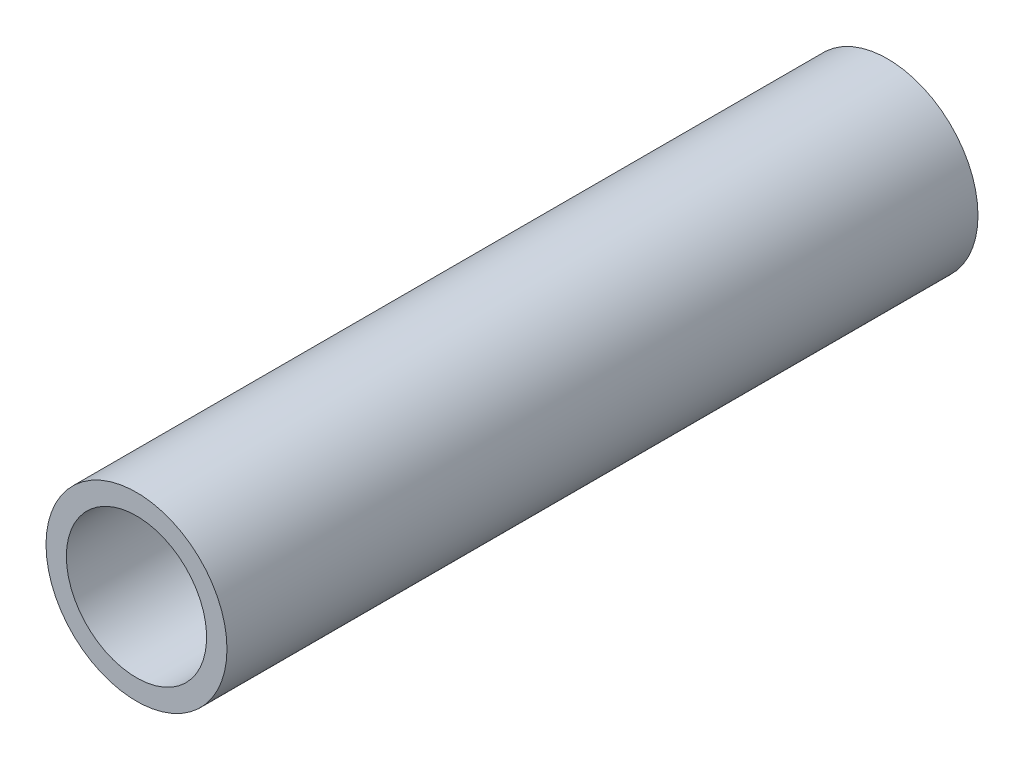
ISO-10303-21;
HEADER;
FILE_DESCRIPTION(('STEP AP214'),'2;1');
FILE_NAME('part.step','',(''),(''),'','','');
FILE_SCHEMA(('AUTOMOTIVE_DESIGN { 1 0 10303 214 1 1 1 1 }'));
ENDSEC;
DATA;
#1=APPLICATION_CONTEXT('core data for automotive mechanical design processes');
#2=APPLICATION_PROTOCOL_DEFINITION('international standard','automotive_design',2000,#1);
#3=PRODUCT_CONTEXT('',#1,'mechanical');
#4=PRODUCT('Part','Part','',(#3));
#5=PRODUCT_RELATED_PRODUCT_CATEGORY('part','',(#4));
#6=PRODUCT_DEFINITION_FORMATION('','',#4);
#7=PRODUCT_DEFINITION_CONTEXT('part definition',#1,'design');
#8=PRODUCT_DEFINITION('design','',#6,#7);
#9=PRODUCT_DEFINITION_SHAPE('','',#8);
#10=(LENGTH_UNIT() NAMED_UNIT(*) SI_UNIT(.MILLI.,.METRE.));
#11=(NAMED_UNIT(*) PLANE_ANGLE_UNIT() SI_UNIT($,.RADIAN.));
#12=(NAMED_UNIT(*) SI_UNIT($,.STERADIAN.) SOLID_ANGLE_UNIT());
#13=UNCERTAINTY_MEASURE_WITH_UNIT(LENGTH_MEASURE(1.E-05),#10,'distance_accuracy_value','');
#14=(GEOMETRIC_REPRESENTATION_CONTEXT(3) GLOBAL_UNCERTAINTY_ASSIGNED_CONTEXT((#13)) GLOBAL_UNIT_ASSIGNED_CONTEXT((#10,
#11,#12)) REPRESENTATION_CONTEXT('',''));
#15=CARTESIAN_POINT('',(0.,0.,0.));
#16=DIRECTION('',(0.,0.,1.));
#17=DIRECTION('',(1.,0.,0.));
#18=AXIS2_PLACEMENT_3D('',#15,#16,#17);
#19=CARTESIAN_POINT('',(0.,0.,8.3));
#20=DIRECTION('',(0.,0.,1.));
#21=DIRECTION('',(1.,0.,0.));
#22=AXIS2_PLACEMENT_3D('',#19,#20,#21);
#23=PLANE('',#22);
#24=CARTESIAN_POINT('',(0.,0.,8.3));
#25=DIRECTION('',(0.,0.,1.));
#26=DIRECTION('',(1.,0.,0.));
#27=AXIS2_PLACEMENT_3D('',#24,#25,#26);
#28=CIRCLE('',#27,1.);
#29=CARTESIAN_POINT('',(-1.,0.,8.3));
#30=VERTEX_POINT('',#29);
#31=EDGE_CURVE('E10',#30,#30,#28,.T.);
#32=ORIENTED_EDGE('',*,*,#31,.T.);
#33=EDGE_LOOP('',(#32));
#34=FACE_BOUND('',#33,.T.);
#35=CARTESIAN_POINT('',(0.,0.,8.3));
#36=DIRECTION('',(0.,0.,1.));
#37=DIRECTION('',(1.,0.,0.));
#38=AXIS2_PLACEMENT_3D('',#35,#36,#37);
#39=CIRCLE('',#38,0.775);
#40=CARTESIAN_POINT('',(-0.775,0.,8.3));
#41=VERTEX_POINT('',#40);
#42=EDGE_CURVE('E46',#41,#41,#39,.T.);
#43=ORIENTED_EDGE('',*,*,#42,.F.);
#44=EDGE_LOOP('',(#43));
#45=FACE_BOUND('',#44,.T.);
#46=ADVANCED_FACE('F35',(#34,#45),#23,.T.);
#47=CARTESIAN_POINT('',(0.,0.,0.));
#48=DIRECTION('',(0.,0.,1.));
#49=DIRECTION('',(1.,0.,0.));
#50=AXIS2_PLACEMENT_3D('',#47,#48,#49);
#51=PLANE('',#50);
#52=CARTESIAN_POINT('',(0.,0.,0.));
#53=DIRECTION('',(0.,0.,1.));
#54=DIRECTION('',(1.,0.,0.));
#55=AXIS2_PLACEMENT_3D('',#52,#53,#54);
#56=CIRCLE('',#55,1.);
#57=CARTESIAN_POINT('',(-1.,0.,0.));
#58=VERTEX_POINT('',#57);
#59=EDGE_CURVE('E39',#58,#58,#56,.T.);
#60=ORIENTED_EDGE('',*,*,#59,.F.);
#61=EDGE_LOOP('',(#60));
#62=FACE_BOUND('',#61,.T.);
#63=CARTESIAN_POINT('',(0.,0.,0.));
#64=DIRECTION('',(0.,0.,1.));
#65=DIRECTION('',(1.,0.,0.));
#66=AXIS2_PLACEMENT_3D('',#63,#64,#65);
#67=CIRCLE('',#66,0.775);
#68=CARTESIAN_POINT('',(-0.775,0.,0.));
#69=VERTEX_POINT('',#68);
#70=EDGE_CURVE('E48',#69,#69,#67,.T.);
#71=ORIENTED_EDGE('',*,*,#70,.T.);
#72=EDGE_LOOP('',(#71));
#73=FACE_BOUND('',#72,.T.);
#74=ADVANCED_FACE('F58',(#62,#73),#51,.F.);
#75=CARTESIAN_POINT('',(0.,0.,8.3));
#76=DIRECTION('',(0.,0.,-1.));
#77=DIRECTION('',(-1.,0.,0.));
#78=AXIS2_PLACEMENT_3D('',#75,#76,#77);
#79=CYLINDRICAL_SURFACE('',#78,1.);
#80=CARTESIAN_POINT('',(-1.,0.,8.3));
#81=CARTESIAN_POINT('',(-1.,0.,8.21354166666667));
#82=CARTESIAN_POINT('',(-1.,0.,8.12708333333333));
#83=CARTESIAN_POINT('',(-1.,0.,7.95416666666667));
#84=CARTESIAN_POINT('',(-1.,0.,7.86770833333333));
#85=CARTESIAN_POINT('',(-1.,0.,7.69479166666667));
#86=CARTESIAN_POINT('',(-1.,0.,7.60833333333333));
#87=CARTESIAN_POINT('',(-1.,0.,7.43541666666667));
#88=CARTESIAN_POINT('',(-1.,0.,7.34895833333333));
#89=CARTESIAN_POINT('',(-1.,0.,7.17604166666667));
#90=CARTESIAN_POINT('',(-1.,0.,7.08958333333333));
#91=CARTESIAN_POINT('',(-1.,0.,6.91666666666667));
#92=CARTESIAN_POINT('',(-1.,0.,6.83020833333333));
#93=CARTESIAN_POINT('',(-1.,0.,6.65729166666667));
#94=CARTESIAN_POINT('',(-1.,0.,6.57083333333333));
#95=CARTESIAN_POINT('',(-1.,0.,6.39791666666667));
#96=CARTESIAN_POINT('',(-1.,0.,6.31145833333333));
#97=CARTESIAN_POINT('',(-1.,0.,6.13854166666667));
#98=CARTESIAN_POINT('',(-1.,0.,6.05208333333333));
#99=CARTESIAN_POINT('',(-1.,0.,5.87916666666667));
#100=CARTESIAN_POINT('',(-1.,0.,5.79270833333333));
#101=CARTESIAN_POINT('',(-1.,0.,5.61979166666667));
#102=CARTESIAN_POINT('',(-1.,0.,5.53333333333333));
#103=CARTESIAN_POINT('',(-1.,0.,5.36041666666666));
#104=CARTESIAN_POINT('',(-1.,0.,5.27395833333333));
#105=CARTESIAN_POINT('',(-1.,0.,5.10104166666667));
#106=CARTESIAN_POINT('',(-1.,0.,5.01458333333333));
#107=CARTESIAN_POINT('',(-1.,0.,4.84166666666667));
#108=CARTESIAN_POINT('',(-1.,0.,4.75520833333333));
#109=CARTESIAN_POINT('',(-1.,0.,4.58229166666667));
#110=CARTESIAN_POINT('',(-1.,0.,4.49583333333333));
#111=CARTESIAN_POINT('',(-1.,0.,4.32291666666667));
#112=CARTESIAN_POINT('',(-1.,0.,4.23645833333333));
#113=CARTESIAN_POINT('',(-1.,0.,4.06354166666667));
#114=CARTESIAN_POINT('',(-1.,0.,3.97708333333333));
#115=CARTESIAN_POINT('',(-1.,0.,3.80416666666667));
#116=CARTESIAN_POINT('',(-1.,0.,3.71770833333333));
#117=CARTESIAN_POINT('',(-1.,0.,3.54479166666667));
#118=CARTESIAN_POINT('',(-1.,0.,3.45833333333333));
#119=CARTESIAN_POINT('',(-1.,0.,3.28541666666667));
#120=CARTESIAN_POINT('',(-1.,0.,3.19895833333333));
#121=CARTESIAN_POINT('',(-1.,0.,3.02604166666667));
#122=CARTESIAN_POINT('',(-1.,0.,2.93958333333333));
#123=CARTESIAN_POINT('',(-1.,0.,2.76666666666667));
#124=CARTESIAN_POINT('',(-1.,0.,2.68020833333333));
#125=CARTESIAN_POINT('',(-1.,0.,2.50729166666667));
#126=CARTESIAN_POINT('',(-1.,0.,2.42083333333333));
#127=CARTESIAN_POINT('',(-1.,0.,2.24791666666667));
#128=CARTESIAN_POINT('',(-1.,0.,2.16145833333333));
#129=CARTESIAN_POINT('',(-1.,0.,1.98854166666667));
#130=CARTESIAN_POINT('',(-1.,0.,1.90208333333333));
#131=CARTESIAN_POINT('',(-1.,0.,1.72916666666667));
#132=CARTESIAN_POINT('',(-1.,0.,1.64270833333333));
#133=CARTESIAN_POINT('',(-1.,0.,1.46979166666667));
#134=CARTESIAN_POINT('',(-1.,0.,1.38333333333333));
#135=CARTESIAN_POINT('',(-1.,0.,1.21041666666667));
#136=CARTESIAN_POINT('',(-1.,0.,1.12395833333333));
#137=CARTESIAN_POINT('',(-1.,0.,0.951041666666665));
#138=CARTESIAN_POINT('',(-1.,0.,0.864583333333332));
#139=CARTESIAN_POINT('',(-1.,0.,0.691666666666665));
#140=CARTESIAN_POINT('',(-1.,0.,0.605208333333332));
#141=CARTESIAN_POINT('',(-1.,0.,0.432291666666665));
#142=CARTESIAN_POINT('',(-1.,0.,0.345833333333332));
#143=CARTESIAN_POINT('',(-1.,0.,0.172916666666666));
#144=CARTESIAN_POINT('',(-1.,0.,0.086458333333333));
#145=CARTESIAN_POINT('',(-1.,0.,0.));
#146=B_SPLINE_CURVE_WITH_KNOTS('',3,(#80,#81,#82,#83,#84,#85,#86,#87,#88,#89,#90,#91,#92,#93,
#94,#95,#96,#97,#98,#99,#100,#101,#102,#103,#104,#105,#106,#107,#108,#109,#110,#111,#112,#113,
#114,#115,#116,#117,#118,#119,#120,#121,#122,#123,#124,#125,#126,#127,#128,#129,#130,#131,#132,
#133,#134,#135,#136,#137,#138,#139,#140,#141,#142,#143,#144,#145),.UNSPECIFIED.,.F.,.F.,(4,2,2,
2,2,2,2,2,2,2,2,2,2,2,2,2,2,2,2,2,2,2,2,2,2,2,2,2,2,2,2,2,4),(0.,0.259375000000001,
0.518750000000001,0.778125000000001,1.0375,1.296875,1.55625,1.815625,2.075,2.334375,2.59375,
2.853125,3.1125,3.371875,3.63125,3.890625,4.15,4.409375,4.66875,4.928125,5.1875,5.446875,
5.70625,5.965625,6.225,6.484375,6.74375,7.003125,7.2625,7.521875,7.78125,8.040625,8.3),.UNSPECIFIED.);
#147=EDGE_CURVE('BSEAM37',#30,#58,#146,.T.);
#148=ORIENTED_EDGE('',*,*,#31,.F.);
#149=ORIENTED_EDGE('',*,*,#59,.T.);
#150=ORIENTED_EDGE('',*,*,#147,.T.);
#151=ORIENTED_EDGE('',*,*,#147,.F.);
#152=EDGE_LOOP('',(#148,#150,#149,#151));
#153=FACE_BOUND('',#152,.T.);
#154=ADVANCED_FACE('F37',(#153),#79,.T.);
#155=CARTESIAN_POINT('',(0.,0.,8.3));
#156=DIRECTION('',(0.,0.,-1.));
#157=DIRECTION('',(-1.,0.,0.));
#158=AXIS2_PLACEMENT_3D('',#155,#156,#157);
#159=CYLINDRICAL_SURFACE('',#158,0.775);
#160=CARTESIAN_POINT('',(-0.775,0.,8.3));
#161=CARTESIAN_POINT('',(-0.775,0.,8.21354166666667));
#162=CARTESIAN_POINT('',(-0.775,0.,8.12708333333333));
#163=CARTESIAN_POINT('',(-0.775,0.,7.95416666666667));
#164=CARTESIAN_POINT('',(-0.775,0.,7.86770833333333));
#165=CARTESIAN_POINT('',(-0.775,0.,7.69479166666667));
#166=CARTESIAN_POINT('',(-0.775,0.,7.60833333333333));
#167=CARTESIAN_POINT('',(-0.775,0.,7.43541666666667));
#168=CARTESIAN_POINT('',(-0.775,0.,7.34895833333333));
#169=CARTESIAN_POINT('',(-0.775,0.,7.17604166666667));
#170=CARTESIAN_POINT('',(-0.775,0.,7.08958333333333));
#171=CARTESIAN_POINT('',(-0.775,0.,6.91666666666667));
#172=CARTESIAN_POINT('',(-0.775,0.,6.83020833333333));
#173=CARTESIAN_POINT('',(-0.775,0.,6.65729166666667));
#174=CARTESIAN_POINT('',(-0.775,0.,6.57083333333333));
#175=CARTESIAN_POINT('',(-0.775,0.,6.39791666666667));
#176=CARTESIAN_POINT('',(-0.775,0.,6.31145833333333));
#177=CARTESIAN_POINT('',(-0.775,0.,6.13854166666667));
#178=CARTESIAN_POINT('',(-0.775,0.,6.05208333333333));
#179=CARTESIAN_POINT('',(-0.775,0.,5.87916666666667));
#180=CARTESIAN_POINT('',(-0.775,0.,5.79270833333333));
#181=CARTESIAN_POINT('',(-0.775,0.,5.61979166666667));
#182=CARTESIAN_POINT('',(-0.775,0.,5.53333333333333));
#183=CARTESIAN_POINT('',(-0.775,0.,5.36041666666666));
#184=CARTESIAN_POINT('',(-0.775,0.,5.27395833333333));
#185=CARTESIAN_POINT('',(-0.775,0.,5.10104166666667));
#186=CARTESIAN_POINT('',(-0.775,0.,5.01458333333333));
#187=CARTESIAN_POINT('',(-0.775,0.,4.84166666666667));
#188=CARTESIAN_POINT('',(-0.775,0.,4.75520833333333));
#189=CARTESIAN_POINT('',(-0.775,0.,4.58229166666667));
#190=CARTESIAN_POINT('',(-0.775,0.,4.49583333333333));
#191=CARTESIAN_POINT('',(-0.775,0.,4.32291666666667));
#192=CARTESIAN_POINT('',(-0.775,0.,4.23645833333333));
#193=CARTESIAN_POINT('',(-0.775,0.,4.06354166666667));
#194=CARTESIAN_POINT('',(-0.775,0.,3.97708333333333));
#195=CARTESIAN_POINT('',(-0.775,0.,3.80416666666667));
#196=CARTESIAN_POINT('',(-0.775,0.,3.71770833333333));
#197=CARTESIAN_POINT('',(-0.775,0.,3.54479166666667));
#198=CARTESIAN_POINT('',(-0.775,0.,3.45833333333333));
#199=CARTESIAN_POINT('',(-0.775,0.,3.28541666666667));
#200=CARTESIAN_POINT('',(-0.775,0.,3.19895833333333));
#201=CARTESIAN_POINT('',(-0.775,0.,3.02604166666667));
#202=CARTESIAN_POINT('',(-0.775,0.,2.93958333333333));
#203=CARTESIAN_POINT('',(-0.775,0.,2.76666666666667));
#204=CARTESIAN_POINT('',(-0.775,0.,2.68020833333333));
#205=CARTESIAN_POINT('',(-0.775,0.,2.50729166666667));
#206=CARTESIAN_POINT('',(-0.775,0.,2.42083333333333));
#207=CARTESIAN_POINT('',(-0.775,0.,2.24791666666667));
#208=CARTESIAN_POINT('',(-0.775,0.,2.16145833333333));
#209=CARTESIAN_POINT('',(-0.775,0.,1.98854166666667));
#210=CARTESIAN_POINT('',(-0.775,0.,1.90208333333333));
#211=CARTESIAN_POINT('',(-0.775,0.,1.72916666666667));
#212=CARTESIAN_POINT('',(-0.775,0.,1.64270833333333));
#213=CARTESIAN_POINT('',(-0.775,0.,1.46979166666667));
#214=CARTESIAN_POINT('',(-0.775,0.,1.38333333333333));
#215=CARTESIAN_POINT('',(-0.775,0.,1.21041666666667));
#216=CARTESIAN_POINT('',(-0.775,0.,1.12395833333333));
#217=CARTESIAN_POINT('',(-0.775,0.,0.951041666666665));
#218=CARTESIAN_POINT('',(-0.775,0.,0.864583333333332));
#219=CARTESIAN_POINT('',(-0.775,0.,0.691666666666665));
#220=CARTESIAN_POINT('',(-0.775,0.,0.605208333333332));
#221=CARTESIAN_POINT('',(-0.775,0.,0.432291666666665));
#222=CARTESIAN_POINT('',(-0.775,0.,0.345833333333332));
#223=CARTESIAN_POINT('',(-0.775,0.,0.172916666666666));
#224=CARTESIAN_POINT('',(-0.775,0.,0.086458333333333));
#225=CARTESIAN_POINT('',(-0.775,0.,0.));
#226=B_SPLINE_CURVE_WITH_KNOTS('',3,(#160,#161,#162,#163,#164,#165,#166,#167,#168,#169,#170,
#171,#172,#173,#174,#175,#176,#177,#178,#179,#180,#181,#182,#183,#184,#185,#186,#187,#188,#189,
#190,#191,#192,#193,#194,#195,#196,#197,#198,#199,#200,#201,#202,#203,#204,#205,#206,#207,#208,
#209,#210,#211,#212,#213,#214,#215,#216,#217,#218,#219,#220,#221,#222,#223,#224,#225),
.UNSPECIFIED.,.F.,.F.,(4,2,2,2,2,2,2,2,2,2,2,2,2,2,2,2,2,2,2,2,2,2,2,2,2,2,2,2,2,2,2,2,4),(0.,
0.259375000000001,0.518750000000001,0.778125000000001,1.0375,1.296875,1.55625,1.815625,2.075,
2.334375,2.59375,2.853125,3.1125,3.371875,3.63125,3.890625,4.15,4.409375,4.66875,4.928125,
5.1875,5.446875,5.70625,5.965625,6.225,6.484375,6.74375,7.003125,7.2625,7.521875,7.78125,
8.040625,8.3),.UNSPECIFIED.);
#227=EDGE_CURVE('BSEAM54',#41,#69,#226,.T.);
#228=ORIENTED_EDGE('',*,*,#42,.T.);
#229=ORIENTED_EDGE('',*,*,#70,.F.);
#230=ORIENTED_EDGE('',*,*,#227,.T.);
#231=ORIENTED_EDGE('',*,*,#227,.F.);
#232=EDGE_LOOP('',(#228,#230,#229,#231));
#233=FACE_BOUND('',#232,.T.);
#234=ADVANCED_FACE('F54',(#233),#159,.F.);
#235=CLOSED_SHELL('',(#46,#74,#154,#234));
#236=MANIFOLD_SOLID_BREP('B2',#235);
#237=ADVANCED_BREP_SHAPE_REPRESENTATION('',(#18,#236),#14);
#238=SHAPE_DEFINITION_REPRESENTATION(#9,#237);
ENDSEC;
END-ISO-10303-21;
